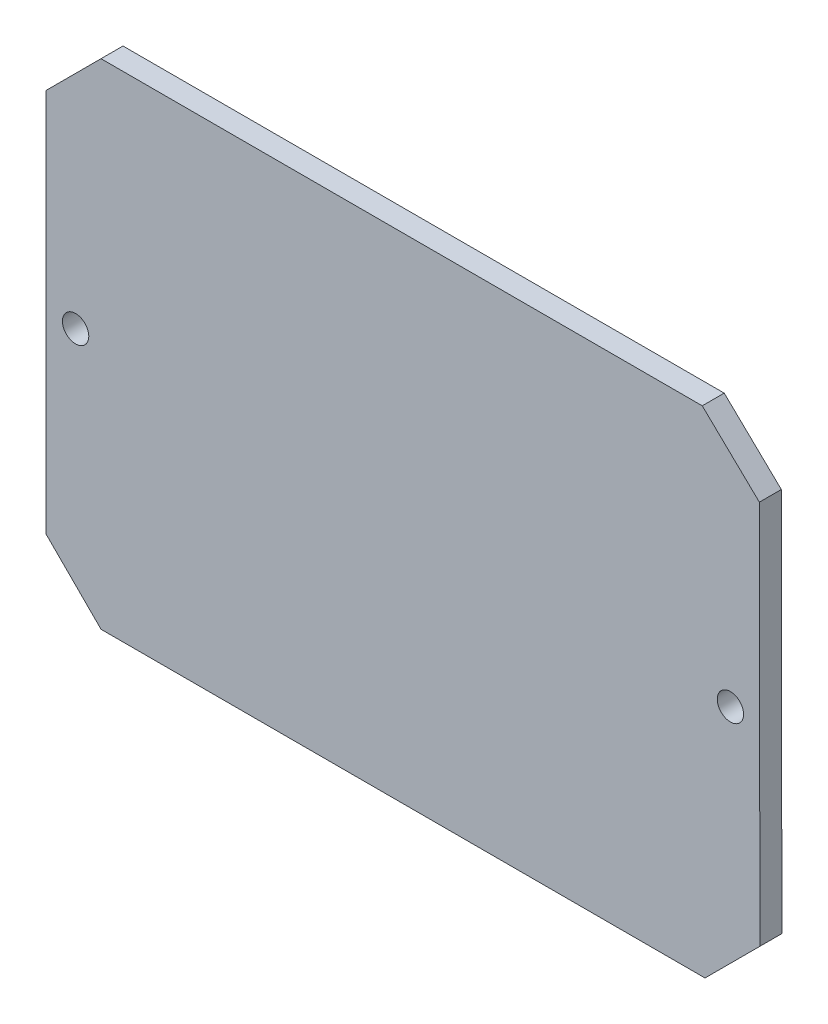
ISO-10303-21;
HEADER;
FILE_DESCRIPTION(('STEP AP214'),'2;1');
FILE_NAME('part.step','',(''),(''),'','','');
FILE_SCHEMA(('AUTOMOTIVE_DESIGN { 1 0 10303 214 1 1 1 1 }'));
ENDSEC;
DATA;
#1=APPLICATION_CONTEXT('core data for automotive mechanical design processes');
#2=APPLICATION_PROTOCOL_DEFINITION('international standard','automotive_design',2000,#1);
#3=PRODUCT_CONTEXT('',#1,'mechanical');
#4=PRODUCT('Part','Part','',(#3));
#5=PRODUCT_RELATED_PRODUCT_CATEGORY('part','',(#4));
#6=PRODUCT_DEFINITION_FORMATION('','',#4);
#7=PRODUCT_DEFINITION_CONTEXT('part definition',#1,'design');
#8=PRODUCT_DEFINITION('design','',#6,#7);
#9=PRODUCT_DEFINITION_SHAPE('','',#8);
#10=(LENGTH_UNIT() NAMED_UNIT(*) SI_UNIT(.MILLI.,.METRE.));
#11=(NAMED_UNIT(*) PLANE_ANGLE_UNIT() SI_UNIT($,.RADIAN.));
#12=(NAMED_UNIT(*) SI_UNIT($,.STERADIAN.) SOLID_ANGLE_UNIT());
#13=UNCERTAINTY_MEASURE_WITH_UNIT(LENGTH_MEASURE(1.E-05),#10,'distance_accuracy_value','');
#14=(GEOMETRIC_REPRESENTATION_CONTEXT(3) GLOBAL_UNCERTAINTY_ASSIGNED_CONTEXT((#13)) GLOBAL_UNIT_ASSIGNED_CONTEXT((#10,
#11,#12)) REPRESENTATION_CONTEXT('',''));
#15=CARTESIAN_POINT('',(0.,0.,0.));
#16=DIRECTION('',(0.,0.,1.));
#17=DIRECTION('',(1.,0.,0.));
#18=AXIS2_PLACEMENT_3D('',#15,#16,#17);
#19=CARTESIAN_POINT('',(210.577991135007,-25.2625096088057,6.35));
#20=DIRECTION('',(0.,0.,-1.));
#21=DIRECTION('',(-1.,0.,0.));
#22=AXIS2_PLACEMENT_3D('',#19,#20,#21);
#23=PLANE('',#22);
#24=CARTESIAN_POINT('',(145.461332337899,-26.140965422865,6.35));
#25=DIRECTION('',(0.,0.,1.));
#26=DIRECTION('',(1.,0.,0.));
#27=AXIS2_PLACEMENT_3D('',#24,#25,#26);
#28=CIRCLE('',#27,3.81000000000001);
#29=CARTESIAN_POINT('',(149.271332337899,-26.140965422865,6.35));
#30=VERTEX_POINT('',#29);
#31=EDGE_CURVE('E134',#30,#30,#28,.T.);
#32=ORIENTED_EDGE('',*,*,#31,.F.);
#33=EDGE_LOOP('',(#32));
#34=FACE_BOUND('',#33,.T.);
#35=DIRECTION('',(-0.721000101473749,0.692934956308919,0.));
#36=VECTOR('',#35,1.);
#37=CARTESIAN_POINT('',(137.315954212448,45.1477805565753,6.35));
#38=LINE('',#37,#36);
#39=CARTESIAN_POINT('',(153.830668099787,29.2759068597664,6.35));
#40=VERTEX_POINT('',#39);
#41=CARTESIAN_POINT('',(137.315954212448,45.1477805565753,6.35));
#42=VERTEX_POINT('',#41);
#43=EDGE_CURVE('E145',#40,#42,#38,.T.);
#44=ORIENTED_EDGE('',*,*,#43,.T.);
#45=DIRECTION('',(-1.,0.,0.));
#46=VECTOR('',#45,1.);
#47=CARTESIAN_POINT('',(-36.5117186996123,45.1477805565753,6.35));
#48=LINE('',#47,#46);
#49=CARTESIAN_POINT('',(-36.5117186996123,45.1477805565753,6.35));
#50=VERTEX_POINT('',#49);
#51=EDGE_CURVE('E93',#42,#50,#48,.T.);
#52=ORIENTED_EDGE('',*,*,#51,.T.);
#53=DIRECTION('',(-0.707106781186548,-0.707106781186547,0.));
#54=VECTOR('',#53,1.);
#55=CARTESIAN_POINT('',(-52.3867186996123,29.2727805565753,6.35));
#56=LINE('',#55,#54);
#57=CARTESIAN_POINT('',(-52.3867186996123,29.2727805565753,6.35));
#58=VERTEX_POINT('',#57);
#59=EDGE_CURVE('E160',#50,#58,#56,.T.);
#60=ORIENTED_EDGE('',*,*,#59,.T.);
#61=DIRECTION('',(0.,-1.,0.));
#62=VECTOR('',#61,1.);
#63=CARTESIAN_POINT('',(-52.3867186996123,-81.8522194434246,6.35));
#64=LINE('',#63,#62);
#65=CARTESIAN_POINT('',(-52.3867186996123,-81.8522194434246,6.35));
#66=VERTEX_POINT('',#65);
#67=EDGE_CURVE('E173',#58,#66,#64,.T.);
#68=ORIENTED_EDGE('',*,*,#67,.T.);
#69=DIRECTION('',(0.707106781186547,-0.707106781186548,0.));
#70=VECTOR('',#69,1.);
#71=CARTESIAN_POINT('',(-36.5117186996123,-97.7272194434247,6.35));
#72=LINE('',#71,#70);
#73=CARTESIAN_POINT('',(-36.5117186996123,-97.7272194434247,6.35));
#74=VERTEX_POINT('',#73);
#75=EDGE_CURVE('E112',#66,#74,#72,.T.);
#76=ORIENTED_EDGE('',*,*,#75,.T.);
#77=DIRECTION('',(1.,0.,0.));
#78=VECTOR('',#77,1.);
#79=CARTESIAN_POINT('',(138.113281300388,-97.7272194434247,6.35));
#80=LINE('',#79,#78);
#81=CARTESIAN_POINT('',(138.113281300388,-97.7272194434247,6.35));
#82=VERTEX_POINT('',#81);
#83=EDGE_CURVE('E106',#74,#82,#80,.T.);
#84=ORIENTED_EDGE('',*,*,#83,.T.);
#85=DIRECTION('',(0.707106781186548,0.707106781186547,0.));
#86=VECTOR('',#85,1.);
#87=CARTESIAN_POINT('',(153.988281300388,-81.8522194434246,6.35));
#88=LINE('',#87,#86);
#89=CARTESIAN_POINT('',(153.988281300388,-81.8522194434246,6.35));
#90=VERTEX_POINT('',#89);
#91=EDGE_CURVE('E110',#82,#90,#88,.T.);
#92=ORIENTED_EDGE('',*,*,#91,.T.);
#93=DIRECTION('',(-0.00141830018482644,0.999998994211787,0.));
#94=VECTOR('',#93,1.);
#95=CARTESIAN_POINT('',(153.830668099787,29.2759068597664,6.35));
#96=LINE('',#95,#94);
#97=EDGE_CURVE('E50',#90,#40,#96,.T.);
#98=ORIENTED_EDGE('',*,*,#97,.T.);
#99=EDGE_LOOP('',(#44,#52,#60,#68,#76,#84,#92,#98));
#100=FACE_BOUND('',#99,.T.);
#101=CARTESIAN_POINT('',(-43.8613939943728,-26.140965422865,6.35));
#102=DIRECTION('',(0.,0.,1.));
#103=DIRECTION('',(1.,0.,0.));
#104=AXIS2_PLACEMENT_3D('',#101,#102,#103);
#105=CIRCLE('',#104,3.81);
#106=CARTESIAN_POINT('',(-40.0513939943728,-26.140965422865,6.35));
#107=VERTEX_POINT('',#106);
#108=EDGE_CURVE('E182',#107,#107,#105,.T.);
#109=ORIENTED_EDGE('',*,*,#108,.F.);
#110=EDGE_LOOP('',(#109));
#111=FACE_BOUND('',#110,.T.);
#112=ADVANCED_FACE('F33',(#34,#100,#111),#23,.F.);
#113=CARTESIAN_POINT('',(210.577991135007,-25.2625096088057,0.));
#114=DIRECTION('',(0.,0.,-1.));
#115=DIRECTION('',(-1.,0.,0.));
#116=AXIS2_PLACEMENT_3D('',#113,#114,#115);
#117=PLANE('',#116);
#118=CARTESIAN_POINT('',(145.461332337899,-26.140965422865,0.));
#119=DIRECTION('',(0.,0.,1.));
#120=DIRECTION('',(1.,0.,0.));
#121=AXIS2_PLACEMENT_3D('',#118,#119,#120);
#122=CIRCLE('',#121,3.81000000000001);
#123=CARTESIAN_POINT('',(149.271332337899,-26.140965422865,0.));
#124=VERTEX_POINT('',#123);
#125=EDGE_CURVE('E179',#124,#124,#122,.T.);
#126=ORIENTED_EDGE('',*,*,#125,.T.);
#127=EDGE_LOOP('',(#126));
#128=FACE_BOUND('',#127,.T.);
#129=DIRECTION('',(-0.721000101473749,0.692934956308919,0.));
#130=VECTOR('',#129,1.);
#131=CARTESIAN_POINT('',(137.315954212448,45.1477805565753,0.));
#132=LINE('',#131,#130);
#133=CARTESIAN_POINT('',(153.830668099787,29.2759068597664,0.));
#134=VERTEX_POINT('',#133);
#135=CARTESIAN_POINT('',(137.315954212448,45.1477805565753,0.));
#136=VERTEX_POINT('',#135);
#137=EDGE_CURVE('E130',#134,#136,#132,.T.);
#138=ORIENTED_EDGE('',*,*,#137,.F.);
#139=DIRECTION('',(-0.00141830018482644,0.999998994211787,0.));
#140=VECTOR('',#139,1.);
#141=CARTESIAN_POINT('',(153.830668099787,29.2759068597664,0.));
#142=LINE('',#141,#140);
#143=CARTESIAN_POINT('',(153.988281300388,-81.8522194434246,0.));
#144=VERTEX_POINT('',#143);
#145=EDGE_CURVE('E85',#144,#134,#142,.T.);
#146=ORIENTED_EDGE('',*,*,#145,.F.);
#147=DIRECTION('',(0.707106781186548,0.707106781186547,0.));
#148=VECTOR('',#147,1.);
#149=CARTESIAN_POINT('',(153.988281300388,-81.8522194434246,0.));
#150=LINE('',#149,#148);
#151=CARTESIAN_POINT('',(138.113281300388,-97.7272194434247,0.));
#152=VERTEX_POINT('',#151);
#153=EDGE_CURVE('E79',#152,#144,#150,.T.);
#154=ORIENTED_EDGE('',*,*,#153,.F.);
#155=DIRECTION('',(1.,0.,0.));
#156=VECTOR('',#155,1.);
#157=CARTESIAN_POINT('',(138.113281300388,-97.7272194434247,0.));
#158=LINE('',#157,#156);
#159=CARTESIAN_POINT('',(-36.5117186996123,-97.7272194434247,0.));
#160=VERTEX_POINT('',#159);
#161=EDGE_CURVE('E120',#160,#152,#158,.T.);
#162=ORIENTED_EDGE('',*,*,#161,.F.);
#163=DIRECTION('',(0.707106781186547,-0.707106781186548,0.));
#164=VECTOR('',#163,1.);
#165=CARTESIAN_POINT('',(-36.5117186996123,-97.7272194434247,0.));
#166=LINE('',#165,#164);
#167=CARTESIAN_POINT('',(-52.3867186996123,-81.8522194434246,0.));
#168=VERTEX_POINT('',#167);
#169=EDGE_CURVE('E140',#168,#160,#166,.T.);
#170=ORIENTED_EDGE('',*,*,#169,.F.);
#171=DIRECTION('',(0.,-1.,0.));
#172=VECTOR('',#171,1.);
#173=CARTESIAN_POINT('',(-52.3867186996123,-81.8522194434246,0.));
#174=LINE('',#173,#172);
#175=CARTESIAN_POINT('',(-52.3867186996123,29.2727805565753,0.));
#176=VERTEX_POINT('',#175);
#177=EDGE_CURVE('E138',#176,#168,#174,.T.);
#178=ORIENTED_EDGE('',*,*,#177,.F.);
#179=DIRECTION('',(-0.707106781186548,-0.707106781186547,0.));
#180=VECTOR('',#179,1.);
#181=CARTESIAN_POINT('',(-52.3867186996123,29.2727805565753,0.));
#182=LINE('',#181,#180);
#183=CARTESIAN_POINT('',(-36.5117186996123,45.1477805565753,0.));
#184=VERTEX_POINT('',#183);
#185=EDGE_CURVE('E136',#184,#176,#182,.T.);
#186=ORIENTED_EDGE('',*,*,#185,.F.);
#187=DIRECTION('',(-1.,0.,0.));
#188=VECTOR('',#187,1.);
#189=CARTESIAN_POINT('',(-36.5117186996123,45.1477805565753,0.));
#190=LINE('',#189,#188);
#191=EDGE_CURVE('E133',#136,#184,#190,.T.);
#192=ORIENTED_EDGE('',*,*,#191,.F.);
#193=EDGE_LOOP('',(#138,#146,#154,#162,#170,#178,#186,#192));
#194=FACE_BOUND('',#193,.T.);
#195=CARTESIAN_POINT('',(-43.8613939943728,-26.140965422865,0.));
#196=DIRECTION('',(0.,0.,1.));
#197=DIRECTION('',(1.,0.,0.));
#198=AXIS2_PLACEMENT_3D('',#195,#196,#197);
#199=CIRCLE('',#198,3.81);
#200=CARTESIAN_POINT('',(-40.0513939943728,-26.140965422865,0.));
#201=VERTEX_POINT('',#200);
#202=EDGE_CURVE('E185',#201,#201,#199,.T.);
#203=ORIENTED_EDGE('',*,*,#202,.T.);
#204=EDGE_LOOP('',(#203));
#205=FACE_BOUND('',#204,.T.);
#206=ADVANCED_FACE('F164',(#128,#194,#205),#117,.T.);
#207=CARTESIAN_POINT('',(137.315954212448,45.1477805565753,6.35));
#208=DIRECTION('',(-0.692934956308919,-0.721000101473749,0.));
#209=DIRECTION('',(0.721000101473749,-0.692934956308919,0.));
#210=AXIS2_PLACEMENT_3D('',#207,#208,#209);
#211=PLANE('',#210);
#212=ORIENTED_EDGE('',*,*,#137,.T.);
#213=DIRECTION('',(0.,0.,-1.));
#214=VECTOR('',#213,1.);
#215=CARTESIAN_POINT('',(137.315954212448,45.1477805565753,6.35));
#216=LINE('',#215,#214);
#217=EDGE_CURVE('E11',#42,#136,#216,.T.);
#218=ORIENTED_EDGE('',*,*,#217,.F.);
#219=ORIENTED_EDGE('',*,*,#43,.F.);
#220=DIRECTION('',(0.,0.,-1.));
#221=VECTOR('',#220,1.);
#222=CARTESIAN_POINT('',(153.830668099787,29.2759068597664,6.35));
#223=LINE('',#222,#221);
#224=EDGE_CURVE('E126',#40,#134,#223,.T.);
#225=ORIENTED_EDGE('',*,*,#224,.T.);
#226=EDGE_LOOP('',(#212,#218,#219,#225));
#227=FACE_BOUND('',#226,.T.);
#228=ADVANCED_FACE('F35',(#227),#211,.F.);
#229=CARTESIAN_POINT('',(-36.5117186996123,45.1477805565753,6.35));
#230=DIRECTION('',(0.,-1.,0.));
#231=DIRECTION('',(1.,0.,0.));
#232=AXIS2_PLACEMENT_3D('',#229,#230,#231);
#233=PLANE('',#232);
#234=ORIENTED_EDGE('',*,*,#191,.T.);
#235=DIRECTION('',(0.,0.,-1.));
#236=VECTOR('',#235,1.);
#237=CARTESIAN_POINT('',(-36.5117186996123,45.1477805565753,6.35));
#238=LINE('',#237,#236);
#239=EDGE_CURVE('E42',#50,#184,#238,.T.);
#240=ORIENTED_EDGE('',*,*,#239,.F.);
#241=ORIENTED_EDGE('',*,*,#51,.F.);
#242=ORIENTED_EDGE('',*,*,#217,.T.);
#243=EDGE_LOOP('',(#234,#240,#241,#242));
#244=FACE_BOUND('',#243,.T.);
#245=ADVANCED_FACE('F218',(#244),#233,.F.);
#246=CARTESIAN_POINT('',(-52.3867186996123,29.2727805565753,6.35));
#247=DIRECTION('',(0.707106781186547,-0.707106781186548,0.));
#248=DIRECTION('',(0.707106781186548,0.707106781186547,0.));
#249=AXIS2_PLACEMENT_3D('',#246,#247,#248);
#250=PLANE('',#249);
#251=ORIENTED_EDGE('',*,*,#185,.T.);
#252=DIRECTION('',(0.,0.,-1.));
#253=VECTOR('',#252,1.);
#254=CARTESIAN_POINT('',(-52.3867186996123,29.2727805565753,6.35));
#255=LINE('',#254,#253);
#256=EDGE_CURVE('E152',#58,#176,#255,.T.);
#257=ORIENTED_EDGE('',*,*,#256,.F.);
#258=ORIENTED_EDGE('',*,*,#59,.F.);
#259=ORIENTED_EDGE('',*,*,#239,.T.);
#260=EDGE_LOOP('',(#251,#257,#258,#259));
#261=FACE_BOUND('',#260,.T.);
#262=ADVANCED_FACE('F158',(#261),#250,.F.);
#263=CARTESIAN_POINT('',(-52.3867186996123,-81.8522194434246,6.35));
#264=DIRECTION('',(1.,0.,0.));
#265=DIRECTION('',(0.,1.,0.));
#266=AXIS2_PLACEMENT_3D('',#263,#264,#265);
#267=PLANE('',#266);
#268=ORIENTED_EDGE('',*,*,#177,.T.);
#269=DIRECTION('',(0.,0.,-1.));
#270=VECTOR('',#269,1.);
#271=CARTESIAN_POINT('',(-52.3867186996123,-81.8522194434246,6.35));
#272=LINE('',#271,#270);
#273=EDGE_CURVE('E149',#66,#168,#272,.T.);
#274=ORIENTED_EDGE('',*,*,#273,.F.);
#275=ORIENTED_EDGE('',*,*,#67,.F.);
#276=ORIENTED_EDGE('',*,*,#256,.T.);
#277=EDGE_LOOP('',(#268,#274,#275,#276));
#278=FACE_BOUND('',#277,.T.);
#279=ADVANCED_FACE('F169',(#278),#267,.F.);
#280=CARTESIAN_POINT('',(-36.5117186996123,-97.7272194434247,6.35));
#281=DIRECTION('',(0.707106781186548,0.707106781186547,0.));
#282=DIRECTION('',(-0.707106781186547,0.707106781186548,0.));
#283=AXIS2_PLACEMENT_3D('',#280,#281,#282);
#284=PLANE('',#283);
#285=ORIENTED_EDGE('',*,*,#169,.T.);
#286=DIRECTION('',(0.,0.,-1.));
#287=VECTOR('',#286,1.);
#288=CARTESIAN_POINT('',(-36.5117186996123,-97.7272194434247,6.35));
#289=LINE('',#288,#287);
#290=EDGE_CURVE('E121',#74,#160,#289,.T.);
#291=ORIENTED_EDGE('',*,*,#290,.F.);
#292=ORIENTED_EDGE('',*,*,#75,.F.);
#293=ORIENTED_EDGE('',*,*,#273,.T.);
#294=EDGE_LOOP('',(#285,#291,#292,#293));
#295=FACE_BOUND('',#294,.T.);
#296=ADVANCED_FACE('F172',(#295),#284,.F.);
#297=CARTESIAN_POINT('',(138.113281300388,-97.7272194434247,6.35));
#298=DIRECTION('',(0.,1.,0.));
#299=DIRECTION('',(0.,0.,1.));
#300=AXIS2_PLACEMENT_3D('',#297,#298,#299);
#301=PLANE('',#300);
#302=ORIENTED_EDGE('',*,*,#161,.T.);
#303=DIRECTION('',(0.,0.,-1.));
#304=VECTOR('',#303,1.);
#305=CARTESIAN_POINT('',(138.113281300388,-97.7272194434247,6.35));
#306=LINE('',#305,#304);
#307=EDGE_CURVE('E117',#82,#152,#306,.T.);
#308=ORIENTED_EDGE('',*,*,#307,.F.);
#309=ORIENTED_EDGE('',*,*,#83,.F.);
#310=ORIENTED_EDGE('',*,*,#290,.T.);
#311=EDGE_LOOP('',(#302,#308,#309,#310));
#312=FACE_BOUND('',#311,.T.);
#313=ADVANCED_FACE('F118',(#312),#301,.F.);
#314=CARTESIAN_POINT('',(153.988281300388,-81.8522194434246,6.35));
#315=DIRECTION('',(-0.707106781186547,0.707106781186548,0.));
#316=DIRECTION('',(-0.707106781186548,-0.707106781186547,0.));
#317=AXIS2_PLACEMENT_3D('',#314,#315,#316);
#318=PLANE('',#317);
#319=ORIENTED_EDGE('',*,*,#153,.T.);
#320=DIRECTION('',(0.,0.,-1.));
#321=VECTOR('',#320,1.);
#322=CARTESIAN_POINT('',(153.988281300388,-81.8522194434246,6.35));
#323=LINE('',#322,#321);
#324=EDGE_CURVE('E122',#90,#144,#323,.T.);
#325=ORIENTED_EDGE('',*,*,#324,.F.);
#326=ORIENTED_EDGE('',*,*,#91,.F.);
#327=ORIENTED_EDGE('',*,*,#307,.T.);
#328=EDGE_LOOP('',(#319,#325,#326,#327));
#329=FACE_BOUND('',#328,.T.);
#330=ADVANCED_FACE('F124',(#329),#318,.F.);
#331=CARTESIAN_POINT('',(153.830668099787,29.2759068597664,6.35));
#332=DIRECTION('',(-0.999998994211787,-0.00141830018482644,0.));
#333=DIRECTION('',(0.00141830018482644,-0.999998994211787,0.));
#334=AXIS2_PLACEMENT_3D('',#331,#332,#333);
#335=PLANE('',#334);
#336=ORIENTED_EDGE('',*,*,#145,.T.);
#337=ORIENTED_EDGE('',*,*,#224,.F.);
#338=ORIENTED_EDGE('',*,*,#97,.F.);
#339=ORIENTED_EDGE('',*,*,#324,.T.);
#340=EDGE_LOOP('',(#336,#337,#338,#339));
#341=FACE_BOUND('',#340,.T.);
#342=ADVANCED_FACE('F206',(#341),#335,.F.);
#343=CARTESIAN_POINT('',(145.461332337899,-26.140965422865,6.35));
#344=DIRECTION('',(0.,0.,-1.));
#345=DIRECTION('',(-1.,0.,0.));
#346=AXIS2_PLACEMENT_3D('',#343,#344,#345);
#347=CYLINDRICAL_SURFACE('',#346,3.81000000000001);
#348=ORIENTED_EDGE('',*,*,#31,.T.);
#349=EDGE_LOOP('',(#348));
#350=FACE_BOUND('',#349,.T.);
#351=ORIENTED_EDGE('',*,*,#125,.F.);
#352=EDGE_LOOP('',(#351));
#353=FACE_BOUND('',#352,.T.);
#354=ADVANCED_FACE('F203',(#350,#353),#347,.F.);
#355=CARTESIAN_POINT('',(-43.8613939943728,-26.140965422865,6.35));
#356=DIRECTION('',(0.,0.,-1.));
#357=DIRECTION('',(-1.,0.,0.));
#358=AXIS2_PLACEMENT_3D('',#355,#356,#357);
#359=CYLINDRICAL_SURFACE('',#358,3.81);
#360=ORIENTED_EDGE('',*,*,#108,.T.);
#361=EDGE_LOOP('',(#360));
#362=FACE_BOUND('',#361,.T.);
#363=ORIENTED_EDGE('',*,*,#202,.F.);
#364=EDGE_LOOP('',(#363));
#365=FACE_BOUND('',#364,.T.);
#366=ADVANCED_FACE('F191',(#362,#365),#359,.F.);
#367=CLOSED_SHELL('',(#112,#206,#228,#245,#262,#279,#296,#313,#330,#342,#354,#366));
#368=MANIFOLD_SOLID_BREP('B2',#367);
#369=ADVANCED_BREP_SHAPE_REPRESENTATION('',(#18,#368),#14);
#370=SHAPE_DEFINITION_REPRESENTATION(#9,#369);
ENDSEC;
END-ISO-10303-21;
